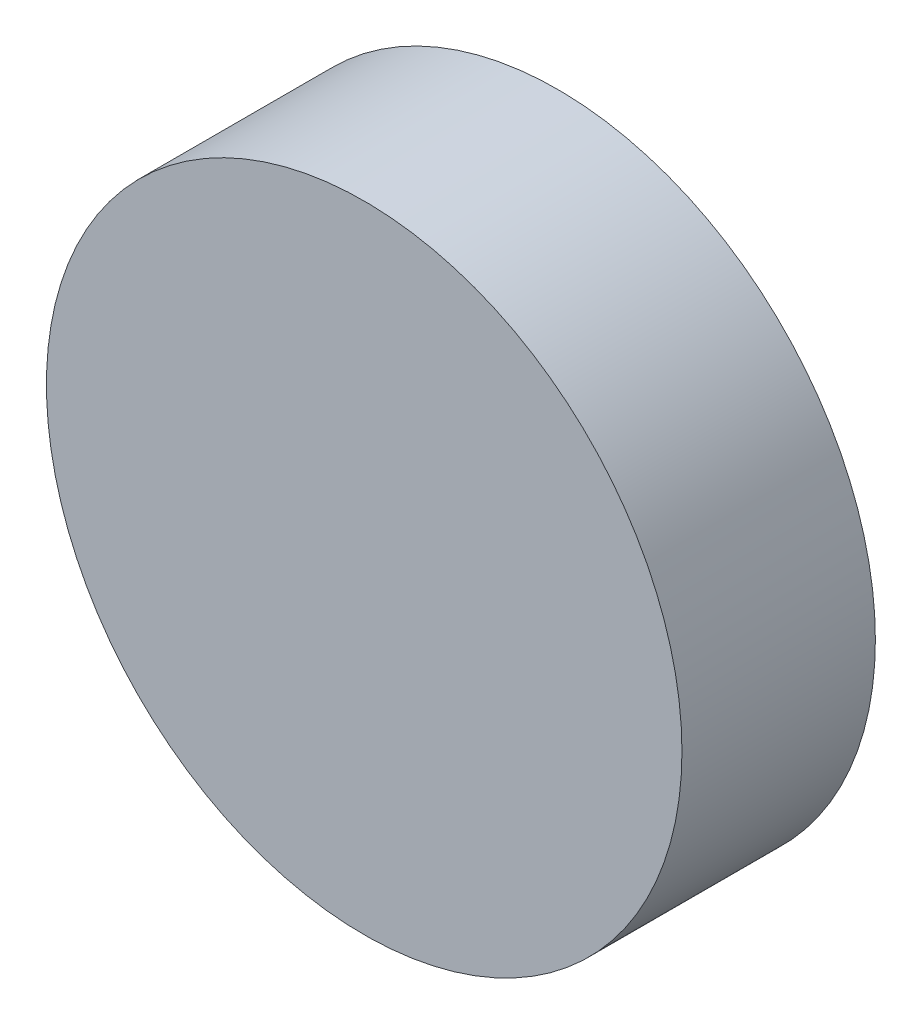
ISO-10303-21;
HEADER;
FILE_DESCRIPTION(('STEP AP214'),'2;1');
FILE_NAME('part.step','',(''),(''),'','','');
FILE_SCHEMA(('AUTOMOTIVE_DESIGN { 1 0 10303 214 1 1 1 1 }'));
ENDSEC;
DATA;
#1=APPLICATION_CONTEXT('core data for automotive mechanical design processes');
#2=APPLICATION_PROTOCOL_DEFINITION('international standard','automotive_design',2000,#1);
#3=PRODUCT_CONTEXT('',#1,'mechanical');
#4=PRODUCT('Part','Part','',(#3));
#5=PRODUCT_RELATED_PRODUCT_CATEGORY('part','',(#4));
#6=PRODUCT_DEFINITION_FORMATION('','',#4);
#7=PRODUCT_DEFINITION_CONTEXT('part definition',#1,'design');
#8=PRODUCT_DEFINITION('design','',#6,#7);
#9=PRODUCT_DEFINITION_SHAPE('','',#8);
#10=(LENGTH_UNIT() NAMED_UNIT(*) SI_UNIT(.MILLI.,.METRE.));
#11=(NAMED_UNIT(*) PLANE_ANGLE_UNIT() SI_UNIT($,.RADIAN.));
#12=(NAMED_UNIT(*) SI_UNIT($,.STERADIAN.) SOLID_ANGLE_UNIT());
#13=UNCERTAINTY_MEASURE_WITH_UNIT(LENGTH_MEASURE(1.E-05),#10,'distance_accuracy_value','');
#14=(GEOMETRIC_REPRESENTATION_CONTEXT(3) GLOBAL_UNCERTAINTY_ASSIGNED_CONTEXT((#13)) GLOBAL_UNIT_ASSIGNED_CONTEXT((#10,
#11,#12)) REPRESENTATION_CONTEXT('',''));
#15=CARTESIAN_POINT('',(0.,0.,0.));
#16=DIRECTION('',(0.,0.,1.));
#17=DIRECTION('',(1.,0.,0.));
#18=AXIS2_PLACEMENT_3D('',#15,#16,#17);
#19=CARTESIAN_POINT('',(0.,0.,28.));
#20=DIRECTION('',(0.,0.,-1.));
#21=DIRECTION('',(-1.,0.,0.));
#22=AXIS2_PLACEMENT_3D('',#19,#20,#21);
#23=CYLINDRICAL_SURFACE('',#22,46.);
#24=CARTESIAN_POINT('',(0.,0.,28.));
#25=DIRECTION('',(0.,0.,1.));
#26=DIRECTION('',(1.,0.,0.));
#27=AXIS2_PLACEMENT_3D('',#24,#25,#26);
#28=CIRCLE('',#27,46.);
#29=CARTESIAN_POINT('',(46.,0.,28.));
#30=VERTEX_POINT('',#29);
#31=EDGE_CURVE('E44',#30,#30,#28,.T.);
#32=ORIENTED_EDGE('',*,*,#31,.F.);
#33=EDGE_LOOP('',(#32));
#34=FACE_BOUND('',#33,.T.);
#35=CARTESIAN_POINT('',(0.,0.,0.));
#36=DIRECTION('',(0.,0.,1.));
#37=DIRECTION('',(1.,0.,0.));
#38=AXIS2_PLACEMENT_3D('',#35,#36,#37);
#39=CIRCLE('',#38,46.);
#40=CARTESIAN_POINT('',(46.,0.,0.));
#41=VERTEX_POINT('',#40);
#42=EDGE_CURVE('E48',#41,#41,#39,.T.);
#43=ORIENTED_EDGE('',*,*,#42,.T.);
#44=EDGE_LOOP('',(#43));
#45=FACE_BOUND('',#44,.T.);
#46=ADVANCED_FACE('F38',(#34,#45),#23,.T.);
#47=CARTESIAN_POINT('',(0.,0.,28.));
#48=DIRECTION('',(0.,0.,1.));
#49=DIRECTION('',(1.,0.,0.));
#50=AXIS2_PLACEMENT_3D('',#47,#48,#49);
#51=PLANE('',#50);
#52=ORIENTED_EDGE('',*,*,#31,.T.);
#53=EDGE_LOOP('',(#52));
#54=FACE_BOUND('',#53,.T.);
#55=ADVANCED_FACE('F99',(#54),#51,.T.);
#56=CARTESIAN_POINT('',(0.,0.,0.));
#57=DIRECTION('',(0.,0.,1.));
#58=DIRECTION('',(1.,0.,0.));
#59=AXIS2_PLACEMENT_3D('',#56,#57,#58);
#60=PLANE('',#59);
#61=CARTESIAN_POINT('',(0.,0.,0.));
#62=DIRECTION('',(0.,0.,1.));
#63=DIRECTION('',(1.,0.,0.));
#64=AXIS2_PLACEMENT_3D('',#61,#62,#63);
#65=CIRCLE('',#64,10.);
#66=CARTESIAN_POINT('',(10.,0.,0.));
#67=VERTEX_POINT('',#66);
#68=EDGE_CURVE('E10',#67,#67,#65,.F.);
#69=ORIENTED_EDGE('',*,*,#68,.F.);
#70=EDGE_LOOP('',(#69));
#71=FACE_BOUND('',#70,.T.);
#72=CARTESIAN_POINT('',(-14.142135623731,14.1421356237309,0.));
#73=DIRECTION('',(0.,0.,-1.));
#74=DIRECTION('',(-1.,0.,0.));
#75=AXIS2_PLACEMENT_3D('',#72,#73,#74);
#76=CIRCLE('',#75,1.5);
#77=CARTESIAN_POINT('',(-15.642135623731,14.1421356237309,0.));
#78=VERTEX_POINT('',#77);
#79=EDGE_CURVE('E58',#78,#78,#76,.T.);
#80=ORIENTED_EDGE('',*,*,#79,.F.);
#81=EDGE_LOOP('',(#80));
#82=FACE_BOUND('',#81,.T.);
#83=CARTESIAN_POINT('',(14.142135623731,-14.1421356237309,0.));
#84=DIRECTION('',(0.,0.,-1.));
#85=DIRECTION('',(-1.,0.,0.));
#86=AXIS2_PLACEMENT_3D('',#83,#84,#85);
#87=CIRCLE('',#86,1.5);
#88=CARTESIAN_POINT('',(12.642135623731,-14.1421356237309,0.));
#89=VERTEX_POINT('',#88);
#90=EDGE_CURVE('E64',#89,#89,#87,.T.);
#91=ORIENTED_EDGE('',*,*,#90,.F.);
#92=EDGE_LOOP('',(#91));
#93=FACE_BOUND('',#92,.T.);
#94=CARTESIAN_POINT('',(-14.142135623731,-14.1421356237309,0.));
#95=DIRECTION('',(0.,0.,-1.));
#96=DIRECTION('',(-1.,0.,0.));
#97=AXIS2_PLACEMENT_3D('',#94,#95,#96);
#98=CIRCLE('',#97,1.5);
#99=CARTESIAN_POINT('',(-15.642135623731,-14.1421356237309,0.));
#100=VERTEX_POINT('',#99);
#101=EDGE_CURVE('E65',#100,#100,#98,.T.);
#102=ORIENTED_EDGE('',*,*,#101,.F.);
#103=EDGE_LOOP('',(#102));
#104=FACE_BOUND('',#103,.T.);
#105=CARTESIAN_POINT('',(14.142135623731,14.1421356237309,0.));
#106=DIRECTION('',(0.,0.,-1.));
#107=DIRECTION('',(-1.,0.,0.));
#108=AXIS2_PLACEMENT_3D('',#105,#106,#107);
#109=CIRCLE('',#108,1.5);
#110=CARTESIAN_POINT('',(12.642135623731,14.1421356237309,0.));
#111=VERTEX_POINT('',#110);
#112=EDGE_CURVE('E55',#111,#111,#109,.T.);
#113=ORIENTED_EDGE('',*,*,#112,.F.);
#114=EDGE_LOOP('',(#113));
#115=FACE_BOUND('',#114,.T.);
#116=ORIENTED_EDGE('',*,*,#42,.F.);
#117=EDGE_LOOP('',(#116));
#118=FACE_BOUND('',#117,.T.);
#119=ADVANCED_FACE('F104',(#71,#82,#93,#104,#115,#118),#60,.F.);
#120=CARTESIAN_POINT('',(14.142135623731,14.1421356237309,5.));
#121=DIRECTION('',(0.,0.,-1.));
#122=DIRECTION('',(-1.,0.,0.));
#123=AXIS2_PLACEMENT_3D('',#120,#121,#122);
#124=CYLINDRICAL_SURFACE('',#123,1.5);
#125=CARTESIAN_POINT('',(14.142135623731,14.1421356237309,5.));
#126=DIRECTION('',(0.,0.,-1.));
#127=DIRECTION('',(-1.,0.,0.));
#128=AXIS2_PLACEMENT_3D('',#125,#126,#127);
#129=CIRCLE('',#128,1.5);
#130=CARTESIAN_POINT('',(12.642135623731,14.1421356237309,5.));
#131=VERTEX_POINT('',#130);
#132=EDGE_CURVE('E53',#131,#131,#129,.T.);
#133=ORIENTED_EDGE('',*,*,#132,.F.);
#134=EDGE_LOOP('',(#133));
#135=FACE_BOUND('',#134,.T.);
#136=ORIENTED_EDGE('',*,*,#112,.T.);
#137=EDGE_LOOP('',(#136));
#138=FACE_BOUND('',#137,.T.);
#139=ADVANCED_FACE('F109',(#135,#138),#124,.F.);
#140=CARTESIAN_POINT('',(14.142135623731,14.1421356237309,5.));
#141=DIRECTION('',(0.,0.,-1.));
#142=DIRECTION('',(-1.,0.,0.));
#143=AXIS2_PLACEMENT_3D('',#140,#141,#142);
#144=PLANE('',#143);
#145=ORIENTED_EDGE('',*,*,#132,.T.);
#146=EDGE_LOOP('',(#145));
#147=FACE_BOUND('',#146,.T.);
#148=ADVANCED_FACE('F114',(#147),#144,.T.);
#149=CARTESIAN_POINT('',(-14.142135623731,-14.1421356237309,5.));
#150=DIRECTION('',(0.,0.,-1.));
#151=DIRECTION('',(-1.,0.,0.));
#152=AXIS2_PLACEMENT_3D('',#149,#150,#151);
#153=CYLINDRICAL_SURFACE('',#152,1.5);
#154=CARTESIAN_POINT('',(-14.142135623731,-14.1421356237309,5.));
#155=DIRECTION('',(0.,0.,-1.));
#156=DIRECTION('',(-1.,0.,0.));
#157=AXIS2_PLACEMENT_3D('',#154,#155,#156);
#158=CIRCLE('',#157,1.5);
#159=CARTESIAN_POINT('',(-15.642135623731,-14.1421356237309,5.));
#160=VERTEX_POINT('',#159);
#161=EDGE_CURVE('E73',#160,#160,#158,.T.);
#162=ORIENTED_EDGE('',*,*,#161,.F.);
#163=EDGE_LOOP('',(#162));
#164=FACE_BOUND('',#163,.T.);
#165=ORIENTED_EDGE('',*,*,#101,.T.);
#166=EDGE_LOOP('',(#165));
#167=FACE_BOUND('',#166,.T.);
#168=ADVANCED_FACE('F121',(#164,#167),#153,.F.);
#169=CARTESIAN_POINT('',(-14.142135623731,-14.1421356237309,5.));
#170=DIRECTION('',(0.,0.,-1.));
#171=DIRECTION('',(-1.,0.,0.));
#172=AXIS2_PLACEMENT_3D('',#169,#170,#171);
#173=PLANE('',#172);
#174=ORIENTED_EDGE('',*,*,#161,.T.);
#175=EDGE_LOOP('',(#174));
#176=FACE_BOUND('',#175,.T.);
#177=ADVANCED_FACE('F129',(#176),#173,.T.);
#178=CARTESIAN_POINT('',(14.142135623731,-14.1421356237309,5.));
#179=DIRECTION('',(0.,0.,-1.));
#180=DIRECTION('',(-1.,0.,0.));
#181=AXIS2_PLACEMENT_3D('',#178,#179,#180);
#182=CYLINDRICAL_SURFACE('',#181,1.5);
#183=CARTESIAN_POINT('',(14.142135623731,-14.1421356237309,5.));
#184=DIRECTION('',(0.,0.,-1.));
#185=DIRECTION('',(-1.,0.,0.));
#186=AXIS2_PLACEMENT_3D('',#183,#184,#185);
#187=CIRCLE('',#186,1.5);
#188=CARTESIAN_POINT('',(12.642135623731,-14.1421356237309,5.));
#189=VERTEX_POINT('',#188);
#190=EDGE_CURVE('E61',#189,#189,#187,.T.);
#191=ORIENTED_EDGE('',*,*,#190,.F.);
#192=EDGE_LOOP('',(#191));
#193=FACE_BOUND('',#192,.T.);
#194=ORIENTED_EDGE('',*,*,#90,.T.);
#195=EDGE_LOOP('',(#194));
#196=FACE_BOUND('',#195,.T.);
#197=ADVANCED_FACE('F126',(#193,#196),#182,.F.);
#198=CARTESIAN_POINT('',(14.142135623731,-14.1421356237309,5.));
#199=DIRECTION('',(0.,0.,-1.));
#200=DIRECTION('',(-1.,0.,0.));
#201=AXIS2_PLACEMENT_3D('',#198,#199,#200);
#202=PLANE('',#201);
#203=ORIENTED_EDGE('',*,*,#190,.T.);
#204=EDGE_LOOP('',(#203));
#205=FACE_BOUND('',#204,.T.);
#206=ADVANCED_FACE('F123',(#205),#202,.T.);
#207=CARTESIAN_POINT('',(-14.142135623731,14.1421356237309,5.));
#208=DIRECTION('',(0.,0.,-1.));
#209=DIRECTION('',(-1.,0.,0.));
#210=AXIS2_PLACEMENT_3D('',#207,#208,#209);
#211=CYLINDRICAL_SURFACE('',#210,1.5);
#212=CARTESIAN_POINT('',(-14.142135623731,14.1421356237309,5.));
#213=DIRECTION('',(0.,0.,-1.));
#214=DIRECTION('',(-1.,0.,0.));
#215=AXIS2_PLACEMENT_3D('',#212,#213,#214);
#216=CIRCLE('',#215,1.5);
#217=CARTESIAN_POINT('',(-15.642135623731,14.1421356237309,5.));
#218=VERTEX_POINT('',#217);
#219=EDGE_CURVE('E68',#218,#218,#216,.T.);
#220=ORIENTED_EDGE('',*,*,#219,.F.);
#221=EDGE_LOOP('',(#220));
#222=FACE_BOUND('',#221,.T.);
#223=ORIENTED_EDGE('',*,*,#79,.T.);
#224=EDGE_LOOP('',(#223));
#225=FACE_BOUND('',#224,.T.);
#226=ADVANCED_FACE('F94',(#222,#225),#211,.F.);
#227=CARTESIAN_POINT('',(-14.142135623731,14.1421356237309,5.));
#228=DIRECTION('',(0.,0.,-1.));
#229=DIRECTION('',(-1.,0.,0.));
#230=AXIS2_PLACEMENT_3D('',#227,#228,#229);
#231=PLANE('',#230);
#232=ORIENTED_EDGE('',*,*,#219,.T.);
#233=EDGE_LOOP('',(#232));
#234=FACE_BOUND('',#233,.T.);
#235=ADVANCED_FACE('F86',(#234),#231,.T.);
#236=CARTESIAN_POINT('',(0.,0.,-2.));
#237=DIRECTION('',(0.,0.,1.));
#238=DIRECTION('',(1.,0.,0.));
#239=AXIS2_PLACEMENT_3D('',#236,#237,#238);
#240=CYLINDRICAL_SURFACE('',#239,10.);
#241=CARTESIAN_POINT('',(0.,0.,-2.));
#242=DIRECTION('',(0.,0.,-1.));
#243=DIRECTION('',(-1.,0.,0.));
#244=AXIS2_PLACEMENT_3D('',#241,#242,#243);
#245=CIRCLE('',#244,10.);
#246=CARTESIAN_POINT('',(-10.,0.,-2.));
#247=VERTEX_POINT('',#246);
#248=EDGE_CURVE('E76',#247,#247,#245,.T.);
#249=ORIENTED_EDGE('',*,*,#248,.F.);
#250=EDGE_LOOP('',(#249));
#251=FACE_BOUND('',#250,.T.);
#252=ORIENTED_EDGE('',*,*,#68,.T.);
#253=EDGE_LOOP('',(#252));
#254=FACE_BOUND('',#253,.T.);
#255=ADVANCED_FACE('F84',(#251,#254),#240,.T.);
#256=CARTESIAN_POINT('',(0.,0.,-2.));
#257=DIRECTION('',(0.,0.,-1.));
#258=DIRECTION('',(-1.,0.,0.));
#259=AXIS2_PLACEMENT_3D('',#256,#257,#258);
#260=PLANE('',#259);
#261=ORIENTED_EDGE('',*,*,#248,.T.);
#262=EDGE_LOOP('',(#261));
#263=FACE_BOUND('',#262,.T.);
#264=ADVANCED_FACE('F82',(#263),#260,.T.);
#265=CLOSED_SHELL('',(#46,#55,#119,#139,#148,#168,#177,#197,#206,#226,#235,#255,#264));
#266=MANIFOLD_SOLID_BREP('B2',#265);
#267=ADVANCED_BREP_SHAPE_REPRESENTATION('',(#18,#266),#14);
#268=SHAPE_DEFINITION_REPRESENTATION(#9,#267);
ENDSEC;
END-ISO-10303-21;
